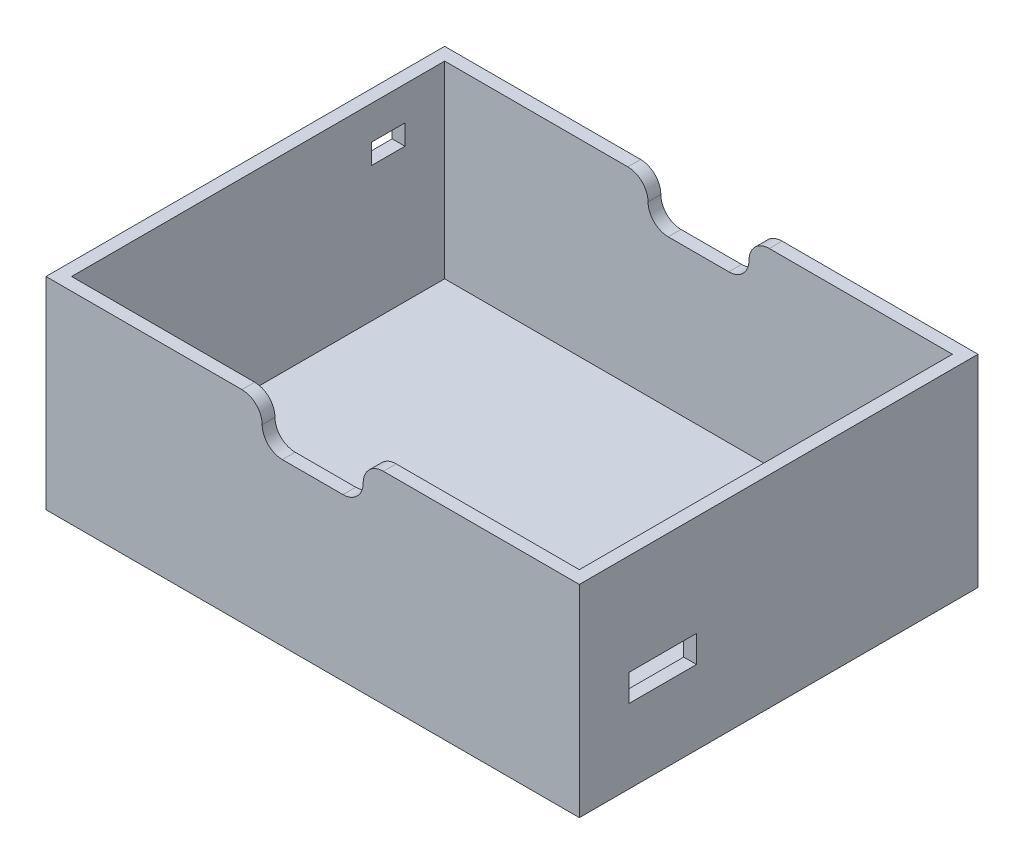
ISO-10303-21;
HEADER;
FILE_DESCRIPTION(('STEP AP214'),'2;1');
FILE_NAME('part.step','',(''),(''),'','','');
FILE_SCHEMA(('AUTOMOTIVE_DESIGN { 1 0 10303 214 1 1 1 1 }'));
ENDSEC;
DATA;
#1=APPLICATION_CONTEXT('core data for automotive mechanical design processes');
#2=APPLICATION_PROTOCOL_DEFINITION('international standard','automotive_design',2000,#1);
#3=PRODUCT_CONTEXT('',#1,'mechanical');
#4=PRODUCT('Part','Part','',(#3));
#5=PRODUCT_RELATED_PRODUCT_CATEGORY('part','',(#4));
#6=PRODUCT_DEFINITION_FORMATION('','',#4);
#7=PRODUCT_DEFINITION_CONTEXT('part definition',#1,'design');
#8=PRODUCT_DEFINITION('design','',#6,#7);
#9=PRODUCT_DEFINITION_SHAPE('','',#8);
#10=(LENGTH_UNIT() NAMED_UNIT(*) SI_UNIT(.MILLI.,.METRE.));
#11=(NAMED_UNIT(*) PLANE_ANGLE_UNIT() SI_UNIT($,.RADIAN.));
#12=(NAMED_UNIT(*) SI_UNIT($,.STERADIAN.) SOLID_ANGLE_UNIT());
#13=UNCERTAINTY_MEASURE_WITH_UNIT(LENGTH_MEASURE(1.E-05),#10,'distance_accuracy_value','');
#14=(GEOMETRIC_REPRESENTATION_CONTEXT(3) GLOBAL_UNCERTAINTY_ASSIGNED_CONTEXT((#13)) GLOBAL_UNIT_ASSIGNED_CONTEXT((#10,
#11,#12)) REPRESENTATION_CONTEXT('',''));
#15=CARTESIAN_POINT('',(0.,0.,0.));
#16=DIRECTION('',(0.,0.,1.));
#17=DIRECTION('',(1.,0.,0.));
#18=AXIS2_PLACEMENT_3D('',#15,#16,#17);
#19=CARTESIAN_POINT('',(0.,2.54,0.));
#20=DIRECTION('',(1.,0.,0.));
#21=DIRECTION('',(0.,0.,-1.));
#22=AXIS2_PLACEMENT_3D('',#19,#20,#21);
#23=PLANE('',#22);
#24=DIRECTION('',(0.,0.,1.));
#25=VECTOR('',#24,1.);
#26=CARTESIAN_POINT('',(0.,0.,0.));
#27=LINE('',#26,#25);
#28=CARTESIAN_POINT('',(0.,0.,-75.184));
#29=VERTEX_POINT('',#28);
#30=CARTESIAN_POINT('',(0.,0.,0.));
#31=VERTEX_POINT('',#30);
#32=EDGE_CURVE('E369',#29,#31,#27,.T.);
#33=ORIENTED_EDGE('',*,*,#32,.T.);
#34=DIRECTION('',(0.,-1.,0.));
#35=VECTOR('',#34,1.);
#36=CARTESIAN_POINT('',(0.,2.54,0.));
#37=LINE('',#36,#35);
#38=CARTESIAN_POINT('',(0.,38.1,0.));
#39=VERTEX_POINT('',#38);
#40=EDGE_CURVE('E394',#39,#31,#37,.T.);
#41=ORIENTED_EDGE('',*,*,#40,.F.);
#42=DIRECTION('',(0.,0.,1.));
#43=VECTOR('',#42,1.);
#44=CARTESIAN_POINT('',(0.,38.1,-75.184));
#45=LINE('',#44,#43);
#46=CARTESIAN_POINT('',(0.,38.1,-75.184));
#47=VERTEX_POINT('',#46);
#48=EDGE_CURVE('E351',#47,#39,#45,.T.);
#49=ORIENTED_EDGE('',*,*,#48,.F.);
#50=DIRECTION('',(0.,-1.,0.));
#51=VECTOR('',#50,1.);
#52=CARTESIAN_POINT('',(0.,2.54,-75.184));
#53=LINE('',#52,#51);
#54=EDGE_CURVE('E382',#47,#29,#53,.T.);
#55=ORIENTED_EDGE('',*,*,#54,.T.);
#56=EDGE_LOOP('',(#33,#41,#49,#55));
#57=FACE_BOUND('',#56,.T.);
#58=DIRECTION('',(0.,0.,1.00000000000002));
#59=VECTOR('',#58,1.);
#60=CARTESIAN_POINT('',(0.,31.750254,5.82867087928207E-13));
#61=LINE('',#60,#59);
#62=CARTESIAN_POINT('',(0.,31.7502539999989,-65.2780000000007));
#63=VERTEX_POINT('',#62);
#64=CARTESIAN_POINT('',(0.,31.7502539999989,-58.9280000000006));
#65=VERTEX_POINT('',#64);
#66=EDGE_CURVE('E258',#63,#65,#61,.T.);
#67=ORIENTED_EDGE('',*,*,#66,.T.);
#68=DIRECTION('',(0.,-1.,0.));
#69=VECTOR('',#68,1.);
#70=CARTESIAN_POINT('',(0.,-8.74300631892311E-13,-58.9280000000015));
#71=LINE('',#70,#69);
#72=CARTESIAN_POINT('',(0.,27.9402539999989,-58.9280000000009));
#73=VERTEX_POINT('',#72);
#74=EDGE_CURVE('E274',#65,#73,#71,.T.);
#75=ORIENTED_EDGE('',*,*,#74,.T.);
#76=DIRECTION('',(0.,0.,-1.00000000000002));
#77=VECTOR('',#76,1.);
#78=CARTESIAN_POINT('',(1.45716771982052E-13,27.9402539999999,2.91433543964104E-13));
#79=LINE('',#78,#77);
#80=CARTESIAN_POINT('',(1.45716771982052E-13,27.9402539999989,-65.2780000000006));
#81=VERTEX_POINT('',#80);
#82=EDGE_CURVE('E270',#73,#81,#79,.T.);
#83=ORIENTED_EDGE('',*,*,#82,.T.);
#84=DIRECTION('',(0.,-1.,0.));
#85=VECTOR('',#84,1.);
#86=CARTESIAN_POINT('',(0.,-1.16573417585641E-12,-65.2780000000012));
#87=LINE('',#86,#85);
#88=EDGE_CURVE('E266',#63,#81,#87,.T.);
#89=ORIENTED_EDGE('',*,*,#88,.F.);
#90=EDGE_LOOP('',(#67,#75,#83,#89));
#91=FACE_BOUND('',#90,.T.);
#92=ADVANCED_FACE('F42',(#57,#91),#23,.F.);
#93=CARTESIAN_POINT('',(2.413,38.1,-72.771));
#94=DIRECTION('',(1.,0.,0.));
#95=DIRECTION('',(0.,0.,-1.));
#96=AXIS2_PLACEMENT_3D('',#93,#94,#95);
#97=PLANE('',#96);
#98=DIRECTION('',(0.,0.,1.));
#99=VECTOR('',#98,1.);
#100=CARTESIAN_POINT('',(2.413,2.54,-72.771));
#101=LINE('',#100,#99);
#102=CARTESIAN_POINT('',(2.413,2.54,-72.771));
#103=VERTEX_POINT('',#102);
#104=CARTESIAN_POINT('',(2.41299999999998,2.54,-2.41300000000001));
#105=VERTEX_POINT('',#104);
#106=EDGE_CURVE('E305',#103,#105,#101,.T.);
#107=ORIENTED_EDGE('',*,*,#106,.F.);
#108=DIRECTION('',(0.,-1.,0.));
#109=VECTOR('',#108,1.);
#110=CARTESIAN_POINT('',(2.413,38.1,-72.771));
#111=LINE('',#110,#109);
#112=CARTESIAN_POINT('',(2.413,38.1,-72.771));
#113=VERTEX_POINT('',#112);
#114=EDGE_CURVE('E324',#113,#103,#111,.T.);
#115=ORIENTED_EDGE('',*,*,#114,.F.);
#116=DIRECTION('',(0.,0.,1.));
#117=VECTOR('',#116,1.);
#118=CARTESIAN_POINT('',(2.413,38.1,-72.771));
#119=LINE('',#118,#117);
#120=CARTESIAN_POINT('',(2.41299999999998,38.1,-2.41300000000001));
#121=VERTEX_POINT('',#120);
#122=EDGE_CURVE('E306',#113,#121,#119,.T.);
#123=ORIENTED_EDGE('',*,*,#122,.T.);
#124=DIRECTION('',(0.,-1.,0.));
#125=VECTOR('',#124,1.);
#126=CARTESIAN_POINT('',(2.41299999999998,38.1,-2.41300000000001));
#127=LINE('',#126,#125);
#128=EDGE_CURVE('E347',#121,#105,#127,.T.);
#129=ORIENTED_EDGE('',*,*,#128,.T.);
#130=EDGE_LOOP('',(#107,#115,#123,#129));
#131=FACE_BOUND('',#130,.T.);
#132=DIRECTION('',(0.,1.,0.));
#133=VECTOR('',#132,1.);
#134=CARTESIAN_POINT('',(2.41299999999999,38.0999999999998,-58.9280000000008));
#135=LINE('',#134,#133);
#136=CARTESIAN_POINT('',(2.41299999999999,27.9402539999989,-58.9280000000009));
#137=VERTEX_POINT('',#136);
#138=CARTESIAN_POINT('',(2.41299999999999,31.7502539999989,-58.9280000000006));
#139=VERTEX_POINT('',#138);
#140=EDGE_CURVE('E499',#137,#139,#135,.T.);
#141=ORIENTED_EDGE('',*,*,#140,.T.);
#142=DIRECTION('',(0.,0.,-1.));
#143=VECTOR('',#142,1.);
#144=CARTESIAN_POINT('',(2.413,31.7502539999988,-72.7709999999999));
#145=LINE('',#144,#143);
#146=CARTESIAN_POINT('',(2.41299999999999,31.7502539999989,-65.2780000000006));
#147=VERTEX_POINT('',#146);
#148=EDGE_CURVE('E503',#139,#147,#145,.T.);
#149=ORIENTED_EDGE('',*,*,#148,.T.);
#150=DIRECTION('',(0.,1.,0.));
#151=VECTOR('',#150,1.);
#152=CARTESIAN_POINT('',(2.41299999999999,38.0999999999999,-65.2780000000005));
#153=LINE('',#152,#151);
#154=CARTESIAN_POINT('',(2.41299999999999,27.9402539999989,-65.2780000000007));
#155=VERTEX_POINT('',#154);
#156=EDGE_CURVE('E478',#155,#147,#153,.T.);
#157=ORIENTED_EDGE('',*,*,#156,.F.);
#158=DIRECTION('',(0.,0.,1.));
#159=VECTOR('',#158,1.);
#160=CARTESIAN_POINT('',(2.413,27.9402539999987,-72.7709999999998));
#161=LINE('',#160,#159);
#162=EDGE_CURVE('E495',#155,#137,#161,.T.);
#163=ORIENTED_EDGE('',*,*,#162,.T.);
#164=EDGE_LOOP('',(#141,#149,#157,#163));
#165=FACE_BOUND('',#164,.T.);
#166=ADVANCED_FACE('F536',(#131,#165),#97,.T.);
#167=CARTESIAN_POINT('',(0.,38.1,0.));
#168=DIRECTION('',(0.,1.,0.));
#169=DIRECTION('',(0.,0.,1.));
#170=AXIS2_PLACEMENT_3D('',#167,#168,#169);
#171=PLANE('',#170);
#172=DIRECTION('',(1.,0.,0.));
#173=VECTOR('',#172,1.);
#174=CARTESIAN_POINT('',(2.41299999999998,38.1,-2.41300000000001));
#175=LINE('',#174,#173);
#176=CARTESIAN_POINT('',(63.627,38.1,-2.41299999999999));
#177=VERTEX_POINT('',#176);
#178=CARTESIAN_POINT('',(98.171,38.1,-2.41299999999998));
#179=VERTEX_POINT('',#178);
#180=EDGE_CURVE('E309',#177,#179,#175,.T.);
#181=ORIENTED_EDGE('',*,*,#180,.F.);
#182=DIRECTION('',(0.,0.,-1.));
#183=VECTOR('',#182,1.);
#184=CARTESIAN_POINT('',(63.627,38.1,0.));
#185=LINE('',#184,#183);
#186=CARTESIAN_POINT('',(63.627,38.1,0.));
#187=VERTEX_POINT('',#186);
#188=EDGE_CURVE('E426',#177,#187,#185,.F.);
#189=ORIENTED_EDGE('',*,*,#188,.T.);
#190=DIRECTION('',(1.,0.,0.));
#191=VECTOR('',#190,1.);
#192=CARTESIAN_POINT('',(0.,38.1,0.));
#193=LINE('',#192,#191);
#194=CARTESIAN_POINT('',(100.584,38.1,0.));
#195=VERTEX_POINT('',#194);
#196=EDGE_CURVE('E355',#187,#195,#193,.T.);
#197=ORIENTED_EDGE('',*,*,#196,.T.);
#198=DIRECTION('',(0.,0.,-1.));
#199=VECTOR('',#198,1.);
#200=CARTESIAN_POINT('',(100.584,38.1,-75.184));
#201=LINE('',#200,#199);
#202=CARTESIAN_POINT('',(100.584,38.1,-75.184));
#203=VERTEX_POINT('',#202);
#204=EDGE_CURVE('E360',#195,#203,#201,.T.);
#205=ORIENTED_EDGE('',*,*,#204,.T.);
#206=DIRECTION('',(-1.,0.,0.));
#207=VECTOR('',#206,1.);
#208=CARTESIAN_POINT('',(0.,38.1,-75.184));
#209=LINE('',#208,#207);
#210=CARTESIAN_POINT('',(63.627,38.1,-75.184));
#211=VERTEX_POINT('',#210);
#212=EDGE_CURVE('E365',#203,#211,#209,.T.);
#213=ORIENTED_EDGE('',*,*,#212,.T.);
#214=DIRECTION('',(0.,0.,-1.));
#215=VECTOR('',#214,1.);
#216=CARTESIAN_POINT('',(63.627,38.1,-72.771));
#217=LINE('',#216,#215);
#218=CARTESIAN_POINT('',(63.627,38.1,-72.771));
#219=VERTEX_POINT('',#218);
#220=EDGE_CURVE('E422',#211,#219,#217,.F.);
#221=ORIENTED_EDGE('',*,*,#220,.T.);
#222=DIRECTION('',(-1.,0.,0.));
#223=VECTOR('',#222,1.);
#224=CARTESIAN_POINT('',(2.413,38.1,-72.771));
#225=LINE('',#224,#223);
#226=CARTESIAN_POINT('',(98.171,38.1,-72.771));
#227=VERTEX_POINT('',#226);
#228=EDGE_CURVE('E320',#227,#219,#225,.T.);
#229=ORIENTED_EDGE('',*,*,#228,.F.);
#230=DIRECTION('',(0.,0.,-1.));
#231=VECTOR('',#230,1.);
#232=CARTESIAN_POINT('',(98.171,38.1,-72.771));
#233=LINE('',#232,#231);
#234=EDGE_CURVE('E315',#179,#227,#233,.T.);
#235=ORIENTED_EDGE('',*,*,#234,.F.);
#236=EDGE_LOOP('',(#181,#189,#197,#205,#213,#221,#229,#235));
#237=FACE_BOUND('',#236,.T.);
#238=ADVANCED_FACE('F542',(#237),#171,.T.);
#239=CARTESIAN_POINT('',(0.,2.54,0.));
#240=DIRECTION('',(0.,0.,-1.));
#241=DIRECTION('',(-1.,0.,0.));
#242=AXIS2_PLACEMENT_3D('',#239,#240,#241);
#243=PLANE('',#242);
#244=DIRECTION('',(-1.,0.,0.));
#245=VECTOR('',#244,1.);
#246=CARTESIAN_POINT('',(59.817,30.48,0.));
#247=LINE('',#246,#245);
#248=CARTESIAN_POINT('',(56.007,30.48,0.));
#249=VERTEX_POINT('',#248);
#250=CARTESIAN_POINT('',(44.577,30.48,0.));
#251=VERTEX_POINT('',#250);
#252=EDGE_CURVE('E292',#249,#251,#247,.T.);
#253=ORIENTED_EDGE('',*,*,#252,.T.);
#254=CARTESIAN_POINT('',(44.577,34.29,0.));
#255=DIRECTION('',(0.,0.,-1.));
#256=DIRECTION('',(-1.,0.,0.));
#257=AXIS2_PLACEMENT_3D('',#254,#255,#256);
#258=CIRCLE('',#257,3.81);
#259=CARTESIAN_POINT('',(40.767,34.29,0.));
#260=VERTEX_POINT('',#259);
#261=EDGE_CURVE('E457',#251,#260,#258,.T.);
#262=ORIENTED_EDGE('',*,*,#261,.T.);
#263=CARTESIAN_POINT('',(36.957,34.29,0.));
#264=DIRECTION('',(0.,0.,-1.));
#265=DIRECTION('',(-1.,0.,0.));
#266=AXIS2_PLACEMENT_3D('',#263,#264,#265);
#267=CIRCLE('',#266,3.81);
#268=CARTESIAN_POINT('',(36.957,38.1,0.));
#269=VERTEX_POINT('',#268);
#270=EDGE_CURVE('E419',#260,#269,#267,.F.);
#271=ORIENTED_EDGE('',*,*,#270,.T.);
#272=EDGE_CURVE('E356',#39,#269,#193,.T.);
#273=ORIENTED_EDGE('',*,*,#272,.F.);
#274=ORIENTED_EDGE('',*,*,#40,.T.);
#275=DIRECTION('',(1.,0.,0.));
#276=VECTOR('',#275,1.);
#277=CARTESIAN_POINT('',(0.,0.,0.));
#278=LINE('',#277,#276);
#279=CARTESIAN_POINT('',(100.584,0.,0.));
#280=VERTEX_POINT('',#279);
#281=EDGE_CURVE('E373',#31,#280,#278,.T.);
#282=ORIENTED_EDGE('',*,*,#281,.T.);
#283=DIRECTION('',(0.,-1.,0.));
#284=VECTOR('',#283,1.);
#285=CARTESIAN_POINT('',(100.584,2.54,0.));
#286=LINE('',#285,#284);
#287=EDGE_CURVE('E390',#195,#280,#286,.T.);
#288=ORIENTED_EDGE('',*,*,#287,.F.);
#289=ORIENTED_EDGE('',*,*,#196,.F.);
#290=CARTESIAN_POINT('',(63.627,34.29,0.));
#291=DIRECTION('',(0.,0.,-1.));
#292=DIRECTION('',(-1.,0.,0.));
#293=AXIS2_PLACEMENT_3D('',#290,#291,#292);
#294=CIRCLE('',#293,3.81);
#295=CARTESIAN_POINT('',(59.817,34.29,0.));
#296=VERTEX_POINT('',#295);
#297=EDGE_CURVE('E416',#187,#296,#294,.F.);
#298=ORIENTED_EDGE('',*,*,#297,.T.);
#299=CARTESIAN_POINT('',(56.007,34.29,0.));
#300=DIRECTION('',(0.,0.,-1.));
#301=DIRECTION('',(-1.,0.,0.));
#302=AXIS2_PLACEMENT_3D('',#299,#300,#301);
#303=CIRCLE('',#302,3.81);
#304=EDGE_CURVE('E463',#296,#249,#303,.T.);
#305=ORIENTED_EDGE('',*,*,#304,.T.);
#306=EDGE_LOOP('',(#253,#262,#271,#273,#274,#282,#288,#289,#298,#305));
#307=FACE_BOUND('',#306,.T.);
#308=ADVANCED_FACE('F548',(#307),#243,.F.);
#309=CARTESIAN_POINT('',(100.584,2.54,0.));
#310=DIRECTION('',(-1.,0.,0.));
#311=DIRECTION('',(0.,0.,1.));
#312=AXIS2_PLACEMENT_3D('',#309,#310,#311);
#313=PLANE('',#312);
#314=DIRECTION('',(0.,0.,1.));
#315=VECTOR('',#314,1.);
#316=CARTESIAN_POINT('',(100.584,19.050254,-22.098));
#317=LINE('',#316,#315);
#318=CARTESIAN_POINT('',(100.584,19.050254,-22.098));
#319=VERTEX_POINT('',#318);
#320=CARTESIAN_POINT('',(100.584,19.050254,-9.39799999999998));
#321=VERTEX_POINT('',#320);
#322=EDGE_CURVE('E240',#319,#321,#317,.T.);
#323=ORIENTED_EDGE('',*,*,#322,.F.);
#324=DIRECTION('',(0.,1.,0.));
#325=VECTOR('',#324,1.);
#326=CARTESIAN_POINT('',(100.584,13.970254,-22.098));
#327=LINE('',#326,#325);
#328=CARTESIAN_POINT('',(100.584,13.970254,-22.098));
#329=VERTEX_POINT('',#328);
#330=EDGE_CURVE('E58',#329,#319,#327,.T.);
#331=ORIENTED_EDGE('',*,*,#330,.F.);
#332=DIRECTION('',(0.,0.,-1.));
#333=VECTOR('',#332,1.);
#334=CARTESIAN_POINT('',(100.584,13.970254,-22.098));
#335=LINE('',#334,#333);
#336=CARTESIAN_POINT('',(100.584,13.970254,-9.39799999999998));
#337=VERTEX_POINT('',#336);
#338=EDGE_CURVE('E248',#337,#329,#335,.T.);
#339=ORIENTED_EDGE('',*,*,#338,.F.);
#340=DIRECTION('',(0.,-1.,0.));
#341=VECTOR('',#340,1.);
#342=CARTESIAN_POINT('',(100.584,13.970254,-9.39799999999998));
#343=LINE('',#342,#341);
#344=EDGE_CURVE('E230',#321,#337,#343,.T.);
#345=ORIENTED_EDGE('',*,*,#344,.F.);
#346=EDGE_LOOP('',(#323,#331,#339,#345));
#347=FACE_BOUND('',#346,.T.);
#348=DIRECTION('',(0.,0.,-1.));
#349=VECTOR('',#348,1.);
#350=CARTESIAN_POINT('',(100.584,0.,0.));
#351=LINE('',#350,#349);
#352=CARTESIAN_POINT('',(100.584,0.,-75.184));
#353=VERTEX_POINT('',#352);
#354=EDGE_CURVE('E376',#280,#353,#351,.T.);
#355=ORIENTED_EDGE('',*,*,#354,.T.);
#356=DIRECTION('',(0.,-1.,0.));
#357=VECTOR('',#356,1.);
#358=CARTESIAN_POINT('',(100.584,2.54,-75.184));
#359=LINE('',#358,#357);
#360=EDGE_CURVE('E386',#203,#353,#359,.T.);
#361=ORIENTED_EDGE('',*,*,#360,.F.);
#362=ORIENTED_EDGE('',*,*,#204,.F.);
#363=ORIENTED_EDGE('',*,*,#287,.T.);
#364=EDGE_LOOP('',(#355,#361,#362,#363));
#365=FACE_BOUND('',#364,.T.);
#366=ADVANCED_FACE('F245',(#347,#365),#313,.F.);
#367=CARTESIAN_POINT('',(0.,2.54,-75.184));
#368=DIRECTION('',(0.,0.,1.));
#369=DIRECTION('',(1.,0.,0.));
#370=AXIS2_PLACEMENT_3D('',#367,#368,#369);
#371=PLANE('',#370);
#372=DIRECTION('',(-1.,0.,0.));
#373=VECTOR('',#372,1.);
#374=CARTESIAN_POINT('',(59.817,30.48,-75.184));
#375=LINE('',#374,#373);
#376=CARTESIAN_POINT('',(56.007,30.48,-75.184));
#377=VERTEX_POINT('',#376);
#378=CARTESIAN_POINT('',(44.577,30.48,-75.184));
#379=VERTEX_POINT('',#378);
#380=EDGE_CURVE('E297',#377,#379,#375,.T.);
#381=ORIENTED_EDGE('',*,*,#380,.F.);
#382=CARTESIAN_POINT('',(56.007,34.29,-75.184));
#383=DIRECTION('',(0.,0.,1.));
#384=DIRECTION('',(1.,0.,0.));
#385=AXIS2_PLACEMENT_3D('',#382,#383,#384);
#386=CIRCLE('',#385,3.81);
#387=CARTESIAN_POINT('',(59.817,34.29,-75.184));
#388=VERTEX_POINT('',#387);
#389=EDGE_CURVE('E466',#377,#388,#386,.T.);
#390=ORIENTED_EDGE('',*,*,#389,.T.);
#391=CARTESIAN_POINT('',(63.627,34.29,-75.184));
#392=DIRECTION('',(0.,0.,1.));
#393=DIRECTION('',(1.,0.,0.));
#394=AXIS2_PLACEMENT_3D('',#391,#392,#393);
#395=CIRCLE('',#394,3.81);
#396=EDGE_CURVE('E433',#388,#211,#395,.F.);
#397=ORIENTED_EDGE('',*,*,#396,.T.);
#398=ORIENTED_EDGE('',*,*,#212,.F.);
#399=ORIENTED_EDGE('',*,*,#360,.T.);
#400=DIRECTION('',(-1.,0.,0.));
#401=VECTOR('',#400,1.);
#402=CARTESIAN_POINT('',(0.,0.,-75.184));
#403=LINE('',#402,#401);
#404=EDGE_CURVE('E379',#353,#29,#403,.T.);
#405=ORIENTED_EDGE('',*,*,#404,.T.);
#406=ORIENTED_EDGE('',*,*,#54,.F.);
#407=CARTESIAN_POINT('',(36.957,38.1,-75.184));
#408=VERTEX_POINT('',#407);
#409=EDGE_CURVE('E364',#408,#47,#209,.T.);
#410=ORIENTED_EDGE('',*,*,#409,.F.);
#411=CARTESIAN_POINT('',(36.957,34.29,-75.184));
#412=DIRECTION('',(0.,0.,1.));
#413=DIRECTION('',(1.,0.,0.));
#414=AXIS2_PLACEMENT_3D('',#411,#412,#413);
#415=CIRCLE('',#414,3.81);
#416=CARTESIAN_POINT('',(40.767,34.29,-75.184));
#417=VERTEX_POINT('',#416);
#418=EDGE_CURVE('E430',#408,#417,#415,.F.);
#419=ORIENTED_EDGE('',*,*,#418,.T.);
#420=CARTESIAN_POINT('',(44.577,34.29,-75.184));
#421=DIRECTION('',(0.,0.,1.));
#422=DIRECTION('',(1.,0.,0.));
#423=AXIS2_PLACEMENT_3D('',#420,#421,#422);
#424=CIRCLE('',#423,3.81);
#425=EDGE_CURVE('E472',#417,#379,#424,.T.);
#426=ORIENTED_EDGE('',*,*,#425,.T.);
#427=EDGE_LOOP('',(#381,#390,#397,#398,#399,#405,#406,#410,#419,#426));
#428=FACE_BOUND('',#427,.T.);
#429=ADVANCED_FACE('F653',(#428),#371,.F.);
#430=CARTESIAN_POINT('',(0.,0.,0.));
#431=DIRECTION('',(0.,-1.,0.));
#432=DIRECTION('',(0.,0.,-1.));
#433=AXIS2_PLACEMENT_3D('',#430,#431,#432);
#434=PLANE('',#433);
#435=ORIENTED_EDGE('',*,*,#32,.F.);
#436=ORIENTED_EDGE('',*,*,#404,.F.);
#437=ORIENTED_EDGE('',*,*,#354,.F.);
#438=ORIENTED_EDGE('',*,*,#281,.F.);
#439=EDGE_LOOP('',(#435,#436,#437,#438));
#440=FACE_BOUND('',#439,.T.);
#441=ADVANCED_FACE('F648',(#440),#434,.T.);
#442=ORIENTED_EDGE('',*,*,#272,.T.);
#443=DIRECTION('',(0.,0.,-1.));
#444=VECTOR('',#443,1.);
#445=CARTESIAN_POINT('',(36.957,38.1,-2.413));
#446=LINE('',#445,#444);
#447=CARTESIAN_POINT('',(36.957,38.1,-2.413));
#448=VERTEX_POINT('',#447);
#449=EDGE_CURVE('E406',#269,#448,#446,.T.);
#450=ORIENTED_EDGE('',*,*,#449,.T.);
#451=EDGE_CURVE('E311',#121,#448,#175,.T.);
#452=ORIENTED_EDGE('',*,*,#451,.F.);
#453=ORIENTED_EDGE('',*,*,#122,.F.);
#454=CARTESIAN_POINT('',(36.957,38.1,-72.771));
#455=VERTEX_POINT('',#454);
#456=EDGE_CURVE('E319',#455,#113,#225,.T.);
#457=ORIENTED_EDGE('',*,*,#456,.F.);
#458=DIRECTION('',(0.,0.,-1.));
#459=VECTOR('',#458,1.);
#460=CARTESIAN_POINT('',(36.957,38.1,-75.184));
#461=LINE('',#460,#459);
#462=EDGE_CURVE('E402',#455,#408,#461,.T.);
#463=ORIENTED_EDGE('',*,*,#462,.T.);
#464=ORIENTED_EDGE('',*,*,#409,.T.);
#465=ORIENTED_EDGE('',*,*,#48,.T.);
#466=EDGE_LOOP('',(#442,#450,#452,#453,#457,#463,#464,#465));
#467=FACE_BOUND('',#466,.T.);
#468=ADVANCED_FACE('F597',(#467),#171,.T.);
#469=CARTESIAN_POINT('',(2.41299999999998,38.1,-2.41300000000001));
#470=DIRECTION('',(0.,0.,-1.));
#471=DIRECTION('',(-1.,0.,0.));
#472=AXIS2_PLACEMENT_3D('',#469,#470,#471);
#473=PLANE('',#472);
#474=ORIENTED_EDGE('',*,*,#451,.T.);
#475=CARTESIAN_POINT('',(36.957,34.29,-2.413));
#476=DIRECTION('',(0.,0.,-1.));
#477=DIRECTION('',(-1.,0.,0.));
#478=AXIS2_PLACEMENT_3D('',#475,#476,#477);
#479=CIRCLE('',#478,3.81);
#480=CARTESIAN_POINT('',(40.767,34.29,-2.413));
#481=VERTEX_POINT('',#480);
#482=EDGE_CURVE('E413',#448,#481,#479,.T.);
#483=ORIENTED_EDGE('',*,*,#482,.T.);
#484=CARTESIAN_POINT('',(44.577,34.29,-2.413));
#485=DIRECTION('',(0.,0.,-1.));
#486=DIRECTION('',(-1.,0.,0.));
#487=AXIS2_PLACEMENT_3D('',#484,#485,#486);
#488=CIRCLE('',#487,3.81);
#489=CARTESIAN_POINT('',(44.577,30.48,-2.413));
#490=VERTEX_POINT('',#489);
#491=EDGE_CURVE('E454',#481,#490,#488,.F.);
#492=ORIENTED_EDGE('',*,*,#491,.T.);
#493=DIRECTION('',(-1.,0.,0.));
#494=VECTOR('',#493,1.);
#495=CARTESIAN_POINT('',(2.41299999999998,30.48,-2.41300000000001));
#496=LINE('',#495,#494);
#497=CARTESIAN_POINT('',(56.007,30.48,-2.41299999999999));
#498=VERTEX_POINT('',#497);
#499=EDGE_CURVE('E296',#498,#490,#496,.T.);
#500=ORIENTED_EDGE('',*,*,#499,.F.);
#501=CARTESIAN_POINT('',(56.007,34.29,-2.41299999999999));
#502=DIRECTION('',(0.,0.,-1.));
#503=DIRECTION('',(-1.,0.,0.));
#504=AXIS2_PLACEMENT_3D('',#501,#502,#503);
#505=CIRCLE('',#504,3.81);
#506=CARTESIAN_POINT('',(59.817,34.29,-2.41299999999999));
#507=VERTEX_POINT('',#506);
#508=EDGE_CURVE('E460',#498,#507,#505,.F.);
#509=ORIENTED_EDGE('',*,*,#508,.T.);
#510=CARTESIAN_POINT('',(63.627,34.29,-2.41299999999999));
#511=DIRECTION('',(0.,0.,-1.));
#512=DIRECTION('',(-1.,0.,0.));
#513=AXIS2_PLACEMENT_3D('',#510,#511,#512);
#514=CIRCLE('',#513,3.81);
#515=EDGE_CURVE('E410',#507,#177,#514,.T.);
#516=ORIENTED_EDGE('',*,*,#515,.T.);
#517=ORIENTED_EDGE('',*,*,#180,.T.);
#518=DIRECTION('',(0.,-1.,0.));
#519=VECTOR('',#518,1.);
#520=CARTESIAN_POINT('',(98.171,38.1,-2.41299999999998));
#521=LINE('',#520,#519);
#522=CARTESIAN_POINT('',(98.171,2.54,-2.41299999999998));
#523=VERTEX_POINT('',#522);
#524=EDGE_CURVE('E344',#179,#523,#521,.T.);
#525=ORIENTED_EDGE('',*,*,#524,.T.);
#526=DIRECTION('',(1.,0.,0.));
#527=VECTOR('',#526,1.);
#528=CARTESIAN_POINT('',(2.41299999999998,2.54,-2.41300000000001));
#529=LINE('',#528,#527);
#530=EDGE_CURVE('E328',#105,#523,#529,.T.);
#531=ORIENTED_EDGE('',*,*,#530,.F.);
#532=ORIENTED_EDGE('',*,*,#128,.F.);
#533=EDGE_LOOP('',(#474,#483,#492,#500,#509,#516,#517,#525,#531,#532));
#534=FACE_BOUND('',#533,.T.);
#535=ADVANCED_FACE('F605',(#534),#473,.T.);
#536=CARTESIAN_POINT('',(98.171,38.1,-72.771));
#537=DIRECTION('',(-1.,0.,0.));
#538=DIRECTION('',(0.,0.,1.));
#539=AXIS2_PLACEMENT_3D('',#536,#537,#538);
#540=PLANE('',#539);
#541=DIRECTION('',(0.,-1.,0.));
#542=VECTOR('',#541,1.);
#543=CARTESIAN_POINT('',(98.171,38.1,-22.098));
#544=LINE('',#543,#542);
#545=CARTESIAN_POINT('',(98.171,19.050254,-22.098));
#546=VERTEX_POINT('',#545);
#547=CARTESIAN_POINT('',(98.171,13.970254,-22.098));
#548=VERTEX_POINT('',#547);
#549=EDGE_CURVE('E11',#546,#548,#544,.T.);
#550=ORIENTED_EDGE('',*,*,#549,.F.);
#551=DIRECTION('',(0.,0.,-1.));
#552=VECTOR('',#551,1.);
#553=CARTESIAN_POINT('',(98.171,19.050254,-72.771));
#554=LINE('',#553,#552);
#555=CARTESIAN_POINT('',(98.171,19.050254,-9.39799999999999));
#556=VERTEX_POINT('',#555);
#557=EDGE_CURVE('E507',#556,#546,#554,.T.);
#558=ORIENTED_EDGE('',*,*,#557,.F.);
#559=DIRECTION('',(0.,1.,0.));
#560=VECTOR('',#559,1.);
#561=CARTESIAN_POINT('',(98.171,38.1,-9.39799999999998));
#562=LINE('',#561,#560);
#563=CARTESIAN_POINT('',(98.171,13.970254,-9.39799999999998));
#564=VERTEX_POINT('',#563);
#565=EDGE_CURVE('E233',#564,#556,#562,.T.);
#566=ORIENTED_EDGE('',*,*,#565,.F.);
#567=DIRECTION('',(0.,0.,1.));
#568=VECTOR('',#567,1.);
#569=CARTESIAN_POINT('',(98.171,13.970254,-72.771));
#570=LINE('',#569,#568);
#571=EDGE_CURVE('E51',#548,#564,#570,.T.);
#572=ORIENTED_EDGE('',*,*,#571,.F.);
#573=EDGE_LOOP('',(#550,#558,#566,#572));
#574=FACE_BOUND('',#573,.T.);
#575=DIRECTION('',(0.,0.,-1.));
#576=VECTOR('',#575,1.);
#577=CARTESIAN_POINT('',(98.171,2.54,-72.771));
#578=LINE('',#577,#576);
#579=CARTESIAN_POINT('',(98.171,2.54,-72.771));
#580=VERTEX_POINT('',#579);
#581=EDGE_CURVE('E332',#523,#580,#578,.T.);
#582=ORIENTED_EDGE('',*,*,#581,.F.);
#583=ORIENTED_EDGE('',*,*,#524,.F.);
#584=ORIENTED_EDGE('',*,*,#234,.T.);
#585=DIRECTION('',(0.,-1.,0.));
#586=VECTOR('',#585,1.);
#587=CARTESIAN_POINT('',(98.171,38.1,-72.771));
#588=LINE('',#587,#586);
#589=EDGE_CURVE('E341',#227,#580,#588,.T.);
#590=ORIENTED_EDGE('',*,*,#589,.T.);
#591=EDGE_LOOP('',(#582,#583,#584,#590));
#592=FACE_BOUND('',#591,.T.);
#593=ADVANCED_FACE('F518',(#574,#592),#540,.T.);
#594=CARTESIAN_POINT('',(2.413,38.1,-72.771));
#595=DIRECTION('',(0.,0.,1.));
#596=DIRECTION('',(1.,0.,0.));
#597=AXIS2_PLACEMENT_3D('',#594,#595,#596);
#598=PLANE('',#597);
#599=ORIENTED_EDGE('',*,*,#228,.T.);
#600=CARTESIAN_POINT('',(63.627,34.29,-72.771));
#601=DIRECTION('',(0.,0.,1.));
#602=DIRECTION('',(1.,0.,0.));
#603=AXIS2_PLACEMENT_3D('',#600,#601,#602);
#604=CIRCLE('',#603,3.81);
#605=CARTESIAN_POINT('',(59.817,34.29,-72.771));
#606=VERTEX_POINT('',#605);
#607=EDGE_CURVE('E439',#219,#606,#604,.T.);
#608=ORIENTED_EDGE('',*,*,#607,.T.);
#609=CARTESIAN_POINT('',(56.007,34.29,-72.771));
#610=DIRECTION('',(0.,0.,1.));
#611=DIRECTION('',(1.,0.,0.));
#612=AXIS2_PLACEMENT_3D('',#609,#610,#611);
#613=CIRCLE('',#612,3.81);
#614=CARTESIAN_POINT('',(56.007,30.48,-72.771));
#615=VERTEX_POINT('',#614);
#616=EDGE_CURVE('E469',#606,#615,#613,.F.);
#617=ORIENTED_EDGE('',*,*,#616,.T.);
#618=DIRECTION('',(1.,0.,0.));
#619=VECTOR('',#618,1.);
#620=CARTESIAN_POINT('',(2.413,30.48,-72.771));
#621=LINE('',#620,#619);
#622=CARTESIAN_POINT('',(44.577,30.48,-72.771));
#623=VERTEX_POINT('',#622);
#624=EDGE_CURVE('E398',#623,#615,#621,.T.);
#625=ORIENTED_EDGE('',*,*,#624,.F.);
#626=CARTESIAN_POINT('',(44.577,34.29,-72.771));
#627=DIRECTION('',(0.,0.,1.));
#628=DIRECTION('',(1.,0.,0.));
#629=AXIS2_PLACEMENT_3D('',#626,#627,#628);
#630=CIRCLE('',#629,3.81);
#631=CARTESIAN_POINT('',(40.767,34.29,-72.771));
#632=VERTEX_POINT('',#631);
#633=EDGE_CURVE('E475',#623,#632,#630,.F.);
#634=ORIENTED_EDGE('',*,*,#633,.T.);
#635=CARTESIAN_POINT('',(36.957,34.29,-72.771));
#636=DIRECTION('',(0.,0.,1.));
#637=DIRECTION('',(1.,0.,0.));
#638=AXIS2_PLACEMENT_3D('',#635,#636,#637);
#639=CIRCLE('',#638,3.81);
#640=EDGE_CURVE('E436',#632,#455,#639,.T.);
#641=ORIENTED_EDGE('',*,*,#640,.T.);
#642=ORIENTED_EDGE('',*,*,#456,.T.);
#643=ORIENTED_EDGE('',*,*,#114,.T.);
#644=DIRECTION('',(-1.,0.,0.));
#645=VECTOR('',#644,1.);
#646=CARTESIAN_POINT('',(2.413,2.54,-72.771));
#647=LINE('',#646,#645);
#648=EDGE_CURVE('E310',#580,#103,#647,.T.);
#649=ORIENTED_EDGE('',*,*,#648,.F.);
#650=ORIENTED_EDGE('',*,*,#589,.F.);
#651=EDGE_LOOP('',(#599,#608,#617,#625,#634,#641,#642,#643,#649,#650));
#652=FACE_BOUND('',#651,.T.);
#653=ADVANCED_FACE('F591',(#652),#598,.T.);
#654=CARTESIAN_POINT('',(0.,2.54,0.));
#655=DIRECTION('',(0.,-1.,0.));
#656=DIRECTION('',(0.,0.,-1.));
#657=AXIS2_PLACEMENT_3D('',#654,#655,#656);
#658=PLANE('',#657);
#659=ORIENTED_EDGE('',*,*,#648,.T.);
#660=ORIENTED_EDGE('',*,*,#106,.T.);
#661=ORIENTED_EDGE('',*,*,#530,.T.);
#662=ORIENTED_EDGE('',*,*,#581,.T.);
#663=EDGE_LOOP('',(#659,#660,#661,#662));
#664=FACE_BOUND('',#663,.T.);
#665=ADVANCED_FACE('F617',(#664),#658,.F.);
#666=CARTESIAN_POINT('',(59.817,30.48,0.));
#667=DIRECTION('',(0.,-1.,0.));
#668=DIRECTION('',(0.,0.,-1.));
#669=AXIS2_PLACEMENT_3D('',#666,#667,#668);
#670=PLANE('',#669);
#671=ORIENTED_EDGE('',*,*,#624,.T.);
#672=DIRECTION('',(0.,0.,-1.));
#673=VECTOR('',#672,1.);
#674=CARTESIAN_POINT('',(56.007,30.48,-75.184));
#675=LINE('',#674,#673);
#676=EDGE_CURVE('E451',#615,#377,#675,.T.);
#677=ORIENTED_EDGE('',*,*,#676,.T.);
#678=ORIENTED_EDGE('',*,*,#380,.T.);
#679=DIRECTION('',(0.,0.,-1.));
#680=VECTOR('',#679,1.);
#681=CARTESIAN_POINT('',(44.577,30.48,-72.771));
#682=LINE('',#681,#680);
#683=EDGE_CURVE('E448',#379,#623,#682,.F.);
#684=ORIENTED_EDGE('',*,*,#683,.T.);
#685=EDGE_LOOP('',(#671,#677,#678,#684));
#686=FACE_BOUND('',#685,.T.);
#687=ADVANCED_FACE('F636',(#686),#670,.F.);
#688=ORIENTED_EDGE('',*,*,#499,.T.);
#689=DIRECTION('',(0.,0.,-1.));
#690=VECTOR('',#689,1.);
#691=CARTESIAN_POINT('',(44.577,30.48,0.));
#692=LINE('',#691,#690);
#693=EDGE_CURVE('E445',#490,#251,#692,.F.);
#694=ORIENTED_EDGE('',*,*,#693,.T.);
#695=ORIENTED_EDGE('',*,*,#252,.F.);
#696=DIRECTION('',(0.,0.,-1.));
#697=VECTOR('',#696,1.);
#698=CARTESIAN_POINT('',(56.007,30.48,-2.41299999999999));
#699=LINE('',#698,#697);
#700=EDGE_CURVE('E442',#249,#498,#699,.T.);
#701=ORIENTED_EDGE('',*,*,#700,.T.);
#702=EDGE_LOOP('',(#688,#694,#695,#701));
#703=FACE_BOUND('',#702,.T.);
#704=ADVANCED_FACE('F558',(#703),#670,.F.);
#705=CARTESIAN_POINT('',(44.577,34.29,0.));
#706=DIRECTION('',(0.,0.,1.));
#707=DIRECTION('',(1.,0.,0.));
#708=AXIS2_PLACEMENT_3D('',#705,#706,#707);
#709=CYLINDRICAL_SURFACE('',#708,3.81);
#710=DIRECTION('',(0.,0.,-1.));
#711=VECTOR('',#710,1.);
#712=CARTESIAN_POINT('',(40.767,34.29,-2.413));
#713=LINE('',#712,#711);
#714=EDGE_CURVE('E301',#260,#481,#713,.T.);
#715=ORIENTED_EDGE('',*,*,#714,.F.);
#716=ORIENTED_EDGE('',*,*,#261,.F.);
#717=ORIENTED_EDGE('',*,*,#693,.F.);
#718=ORIENTED_EDGE('',*,*,#491,.F.);
#719=EDGE_LOOP('',(#715,#716,#717,#718));
#720=FACE_BOUND('',#719,.T.);
#721=ADVANCED_FACE('F554',(#720),#709,.F.);
#722=CARTESIAN_POINT('',(36.957,34.29,0.));
#723=DIRECTION('',(0.,0.,1.));
#724=DIRECTION('',(1.,0.,0.));
#725=AXIS2_PLACEMENT_3D('',#722,#723,#724);
#726=CYLINDRICAL_SURFACE('',#725,3.81);
#727=ORIENTED_EDGE('',*,*,#270,.F.);
#728=ORIENTED_EDGE('',*,*,#714,.T.);
#729=ORIENTED_EDGE('',*,*,#482,.F.);
#730=ORIENTED_EDGE('',*,*,#449,.F.);
#731=EDGE_LOOP('',(#727,#728,#729,#730));
#732=FACE_BOUND('',#731,.T.);
#733=ADVANCED_FACE('F550',(#732),#726,.T.);
#734=CARTESIAN_POINT('',(56.007,34.29,0.));
#735=DIRECTION('',(0.,0.,1.));
#736=DIRECTION('',(1.,0.,0.));
#737=AXIS2_PLACEMENT_3D('',#734,#735,#736);
#738=CYLINDRICAL_SURFACE('',#737,3.81);
#739=ORIENTED_EDGE('',*,*,#700,.F.);
#740=ORIENTED_EDGE('',*,*,#304,.F.);
#741=DIRECTION('',(0.,0.,-1.));
#742=VECTOR('',#741,1.);
#743=CARTESIAN_POINT('',(59.817,34.29,0.));
#744=LINE('',#743,#742);
#745=EDGE_CURVE('E482',#507,#296,#744,.F.);
#746=ORIENTED_EDGE('',*,*,#745,.F.);
#747=ORIENTED_EDGE('',*,*,#508,.F.);
#748=EDGE_LOOP('',(#739,#740,#746,#747));
#749=FACE_BOUND('',#748,.T.);
#750=ADVANCED_FACE('F553',(#749),#738,.F.);
#751=CARTESIAN_POINT('',(63.627,34.29,0.));
#752=DIRECTION('',(0.,0.,1.));
#753=DIRECTION('',(1.,0.,0.));
#754=AXIS2_PLACEMENT_3D('',#751,#752,#753);
#755=CYLINDRICAL_SURFACE('',#754,3.81);
#756=ORIENTED_EDGE('',*,*,#297,.F.);
#757=ORIENTED_EDGE('',*,*,#188,.F.);
#758=ORIENTED_EDGE('',*,*,#515,.F.);
#759=ORIENTED_EDGE('',*,*,#745,.T.);
#760=EDGE_LOOP('',(#756,#757,#758,#759));
#761=FACE_BOUND('',#760,.T.);
#762=ADVANCED_FACE('F560',(#761),#755,.T.);
#763=CARTESIAN_POINT('',(56.007,34.29,0.));
#764=DIRECTION('',(0.,0.,1.));
#765=DIRECTION('',(1.,0.,0.));
#766=AXIS2_PLACEMENT_3D('',#763,#764,#765);
#767=CYLINDRICAL_SURFACE('',#766,3.81);
#768=ORIENTED_EDGE('',*,*,#676,.F.);
#769=ORIENTED_EDGE('',*,*,#616,.F.);
#770=DIRECTION('',(0.,0.,-1.));
#771=VECTOR('',#770,1.);
#772=CARTESIAN_POINT('',(59.817,34.29,-72.771));
#773=LINE('',#772,#771);
#774=EDGE_CURVE('E486',#388,#606,#773,.F.);
#775=ORIENTED_EDGE('',*,*,#774,.F.);
#776=ORIENTED_EDGE('',*,*,#389,.F.);
#777=EDGE_LOOP('',(#768,#769,#775,#776));
#778=FACE_BOUND('',#777,.T.);
#779=ADVANCED_FACE('F563',(#778),#767,.F.);
#780=CARTESIAN_POINT('',(63.627,34.29,0.));
#781=DIRECTION('',(0.,0.,1.));
#782=DIRECTION('',(1.,0.,0.));
#783=AXIS2_PLACEMENT_3D('',#780,#781,#782);
#784=CYLINDRICAL_SURFACE('',#783,3.81);
#785=ORIENTED_EDGE('',*,*,#607,.F.);
#786=ORIENTED_EDGE('',*,*,#220,.F.);
#787=ORIENTED_EDGE('',*,*,#396,.F.);
#788=ORIENTED_EDGE('',*,*,#774,.T.);
#789=EDGE_LOOP('',(#785,#786,#787,#788));
#790=FACE_BOUND('',#789,.T.);
#791=ADVANCED_FACE('F568',(#790),#784,.T.);
#792=CARTESIAN_POINT('',(44.577,34.29,0.));
#793=DIRECTION('',(0.,0.,1.));
#794=DIRECTION('',(1.,0.,0.));
#795=AXIS2_PLACEMENT_3D('',#792,#793,#794);
#796=CYLINDRICAL_SURFACE('',#795,3.81);
#797=DIRECTION('',(0.,0.,-1.));
#798=VECTOR('',#797,1.);
#799=CARTESIAN_POINT('',(40.767,34.29,-75.184));
#800=LINE('',#799,#798);
#801=EDGE_CURVE('E282',#632,#417,#800,.T.);
#802=ORIENTED_EDGE('',*,*,#801,.F.);
#803=ORIENTED_EDGE('',*,*,#633,.F.);
#804=ORIENTED_EDGE('',*,*,#683,.F.);
#805=ORIENTED_EDGE('',*,*,#425,.F.);
#806=EDGE_LOOP('',(#802,#803,#804,#805));
#807=FACE_BOUND('',#806,.T.);
#808=ADVANCED_FACE('F44',(#807),#796,.F.);
#809=CARTESIAN_POINT('',(36.957,34.29,0.));
#810=DIRECTION('',(0.,0.,1.));
#811=DIRECTION('',(1.,0.,0.));
#812=AXIS2_PLACEMENT_3D('',#809,#810,#811);
#813=CYLINDRICAL_SURFACE('',#812,3.81);
#814=ORIENTED_EDGE('',*,*,#640,.F.);
#815=ORIENTED_EDGE('',*,*,#801,.T.);
#816=ORIENTED_EDGE('',*,*,#418,.F.);
#817=ORIENTED_EDGE('',*,*,#462,.F.);
#818=EDGE_LOOP('',(#814,#815,#816,#817));
#819=FACE_BOUND('',#818,.T.);
#820=ADVANCED_FACE('F574',(#819),#813,.T.);
#821=CARTESIAN_POINT('',(6.35,31.750254,5.82867087928207E-13));
#822=DIRECTION('',(0.,-1.,0.));
#823=DIRECTION('',(0.,0.,-1.));
#824=AXIS2_PLACEMENT_3D('',#821,#822,#823);
#825=PLANE('',#824);
#826=DIRECTION('',(-1.,0.,0.));
#827=VECTOR('',#826,1.);
#828=CARTESIAN_POINT('',(6.35,31.7502539999989,-58.9280000000006));
#829=LINE('',#828,#827);
#830=EDGE_CURVE('E279',#139,#65,#829,.T.);
#831=ORIENTED_EDGE('',*,*,#830,.T.);
#832=ORIENTED_EDGE('',*,*,#66,.F.);
#833=DIRECTION('',(-1.,0.,0.));
#834=VECTOR('',#833,1.);
#835=CARTESIAN_POINT('',(6.35000000000015,31.7502539999989,-65.2780000000006));
#836=LINE('',#835,#834);
#837=EDGE_CURVE('E278',#147,#63,#836,.T.);
#838=ORIENTED_EDGE('',*,*,#837,.F.);
#839=ORIENTED_EDGE('',*,*,#148,.F.);
#840=EDGE_LOOP('',(#831,#832,#838,#839));
#841=FACE_BOUND('',#840,.T.);
#842=ADVANCED_FACE('F576',(#841),#825,.T.);
#843=CARTESIAN_POINT('',(6.35,-8.74300631892311E-13,-58.9280000000015));
#844=DIRECTION('',(0.,0.,-1.));
#845=DIRECTION('',(0.,1.,0.));
#846=AXIS2_PLACEMENT_3D('',#843,#844,#845);
#847=PLANE('',#846);
#848=DIRECTION('',(-1.,0.,0.));
#849=VECTOR('',#848,1.);
#850=CARTESIAN_POINT('',(6.35,27.9402539999989,-58.9280000000009));
#851=LINE('',#850,#849);
#852=EDGE_CURVE('E283',#137,#73,#851,.T.);
#853=ORIENTED_EDGE('',*,*,#852,.T.);
#854=ORIENTED_EDGE('',*,*,#74,.F.);
#855=ORIENTED_EDGE('',*,*,#830,.F.);
#856=ORIENTED_EDGE('',*,*,#140,.F.);
#857=EDGE_LOOP('',(#853,#854,#855,#856));
#858=FACE_BOUND('',#857,.T.);
#859=ADVANCED_FACE('F582',(#858),#847,.T.);
#860=CARTESIAN_POINT('',(6.35000000000015,27.9402539999999,2.91433543964104E-13));
#861=DIRECTION('',(0.,1.,0.));
#862=DIRECTION('',(0.,0.,1.));
#863=AXIS2_PLACEMENT_3D('',#860,#861,#862);
#864=PLANE('',#863);
#865=DIRECTION('',(-1.,0.,0.));
#866=VECTOR('',#865,1.);
#867=CARTESIAN_POINT('',(6.35000000000015,27.9402539999989,-65.2780000000006));
#868=LINE('',#867,#866);
#869=EDGE_CURVE('E286',#155,#81,#868,.T.);
#870=ORIENTED_EDGE('',*,*,#869,.T.);
#871=ORIENTED_EDGE('',*,*,#82,.F.);
#872=ORIENTED_EDGE('',*,*,#852,.F.);
#873=ORIENTED_EDGE('',*,*,#162,.F.);
#874=EDGE_LOOP('',(#870,#871,#872,#873));
#875=FACE_BOUND('',#874,.T.);
#876=ADVANCED_FACE('F530',(#875),#864,.T.);
#877=CARTESIAN_POINT('',(6.35,-1.16573417585641E-12,-65.2780000000012));
#878=DIRECTION('',(0.,0.,-1.));
#879=DIRECTION('',(0.,1.,0.));
#880=AXIS2_PLACEMENT_3D('',#877,#878,#879);
#881=PLANE('',#880);
#882=ORIENTED_EDGE('',*,*,#156,.T.);
#883=ORIENTED_EDGE('',*,*,#837,.T.);
#884=ORIENTED_EDGE('',*,*,#88,.T.);
#885=ORIENTED_EDGE('',*,*,#869,.F.);
#886=EDGE_LOOP('',(#882,#883,#884,#885));
#887=FACE_BOUND('',#886,.T.);
#888=ADVANCED_FACE('F523',(#887),#881,.F.);
#889=CARTESIAN_POINT('',(94.234,13.970254,-22.098));
#890=DIRECTION('',(0.,0.,-1.));
#891=DIRECTION('',(-1.,0.,0.));
#892=AXIS2_PLACEMENT_3D('',#889,#890,#891);
#893=PLANE('',#892);
#894=ORIENTED_EDGE('',*,*,#549,.T.);
#895=DIRECTION('',(1.,0.,0.));
#896=VECTOR('',#895,1.);
#897=CARTESIAN_POINT('',(94.234,13.970254,-22.098));
#898=LINE('',#897,#896);
#899=EDGE_CURVE('E255',#548,#329,#898,.T.);
#900=ORIENTED_EDGE('',*,*,#899,.T.);
#901=ORIENTED_EDGE('',*,*,#330,.T.);
#902=DIRECTION('',(1.,0.,0.));
#903=VECTOR('',#902,1.);
#904=CARTESIAN_POINT('',(94.234,19.050254,-22.098));
#905=LINE('',#904,#903);
#906=EDGE_CURVE('E237',#546,#319,#905,.T.);
#907=ORIENTED_EDGE('',*,*,#906,.F.);
#908=EDGE_LOOP('',(#894,#900,#901,#907));
#909=FACE_BOUND('',#908,.T.);
#910=ADVANCED_FACE('F520',(#909),#893,.F.);
#911=CARTESIAN_POINT('',(94.234,13.970254,-22.098));
#912=DIRECTION('',(0.,-1.,0.));
#913=DIRECTION('',(0.,0.,-1.));
#914=AXIS2_PLACEMENT_3D('',#911,#912,#913);
#915=PLANE('',#914);
#916=ORIENTED_EDGE('',*,*,#571,.T.);
#917=DIRECTION('',(1.,0.,0.));
#918=VECTOR('',#917,1.);
#919=CARTESIAN_POINT('',(94.234,13.970254,-9.39799999999998));
#920=LINE('',#919,#918);
#921=EDGE_CURVE('E236',#564,#337,#920,.T.);
#922=ORIENTED_EDGE('',*,*,#921,.T.);
#923=ORIENTED_EDGE('',*,*,#338,.T.);
#924=ORIENTED_EDGE('',*,*,#899,.F.);
#925=EDGE_LOOP('',(#916,#922,#923,#924));
#926=FACE_BOUND('',#925,.T.);
#927=ADVANCED_FACE('F515',(#926),#915,.F.);
#928=CARTESIAN_POINT('',(94.234,13.970254,-9.39799999999998));
#929=DIRECTION('',(0.,0.,1.));
#930=DIRECTION('',(1.,0.,0.));
#931=AXIS2_PLACEMENT_3D('',#928,#929,#930);
#932=PLANE('',#931);
#933=ORIENTED_EDGE('',*,*,#565,.T.);
#934=DIRECTION('',(1.,0.,0.));
#935=VECTOR('',#934,1.);
#936=CARTESIAN_POINT('',(94.234,19.050254,-9.39799999999998));
#937=LINE('',#936,#935);
#938=EDGE_CURVE('E66',#556,#321,#937,.T.);
#939=ORIENTED_EDGE('',*,*,#938,.T.);
#940=ORIENTED_EDGE('',*,*,#344,.T.);
#941=ORIENTED_EDGE('',*,*,#921,.F.);
#942=EDGE_LOOP('',(#933,#939,#940,#941));
#943=FACE_BOUND('',#942,.T.);
#944=ADVANCED_FACE('F227',(#943),#932,.F.);
#945=CARTESIAN_POINT('',(94.234,19.050254,-22.098));
#946=DIRECTION('',(0.,1.,0.));
#947=DIRECTION('',(0.,0.,1.));
#948=AXIS2_PLACEMENT_3D('',#945,#946,#947);
#949=PLANE('',#948);
#950=ORIENTED_EDGE('',*,*,#557,.T.);
#951=ORIENTED_EDGE('',*,*,#906,.T.);
#952=ORIENTED_EDGE('',*,*,#322,.T.);
#953=ORIENTED_EDGE('',*,*,#938,.F.);
#954=EDGE_LOOP('',(#950,#951,#952,#953));
#955=FACE_BOUND('',#954,.T.);
#956=ADVANCED_FACE('F241',(#955),#949,.F.);
#957=CLOSED_SHELL('',(#92,#166,#238,#308,#366,#429,#441,#468,#535,#593,#653,#665,#687,#704,#721,
#733,#750,#762,#779,#791,#808,#820,#842,#859,#876,#888,#910,#927,#944,#956));
#958=MANIFOLD_SOLID_BREP('B2',#957);
#959=ADVANCED_BREP_SHAPE_REPRESENTATION('',(#18,#958),#14);
#960=SHAPE_DEFINITION_REPRESENTATION(#9,#959);
ENDSEC;
END-ISO-10303-21;
